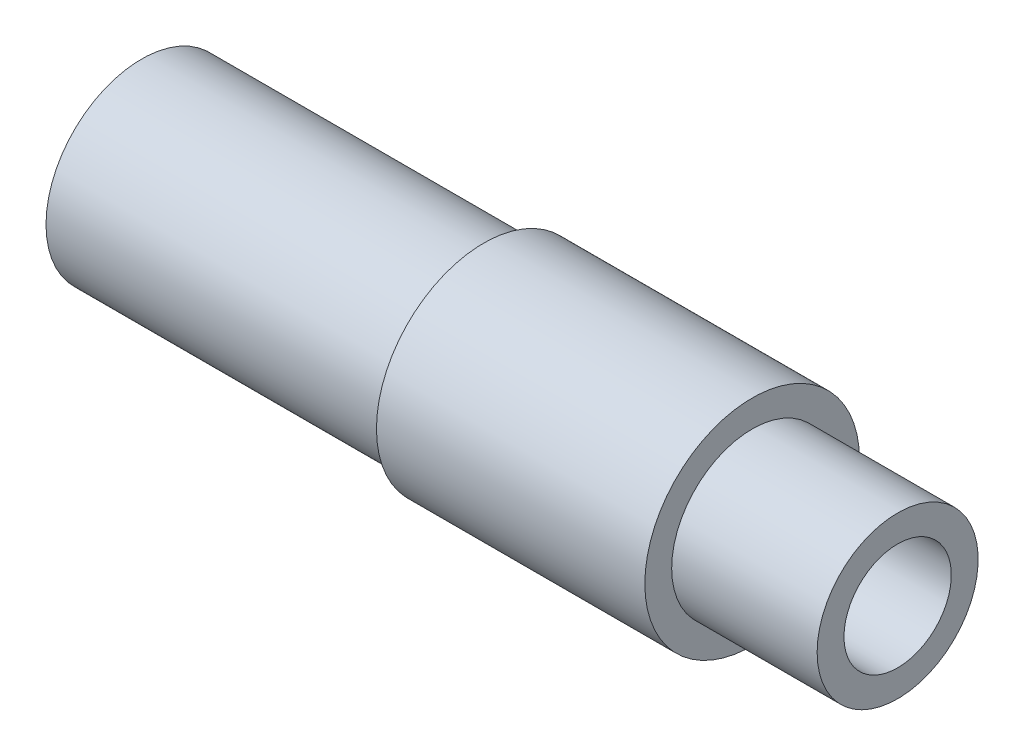
ISO-10303-21;
HEADER;
FILE_DESCRIPTION(('STEP AP214'),'2;1');
FILE_NAME('part.step','',(''),(''),'','','');
FILE_SCHEMA(('AUTOMOTIVE_DESIGN { 1 0 10303 214 1 1 1 1 }'));
ENDSEC;
DATA;
#1=APPLICATION_CONTEXT('core data for automotive mechanical design processes');
#2=APPLICATION_PROTOCOL_DEFINITION('international standard','automotive_design',2000,#1);
#3=PRODUCT_CONTEXT('',#1,'mechanical');
#4=PRODUCT('Part','Part','',(#3));
#5=PRODUCT_RELATED_PRODUCT_CATEGORY('part','',(#4));
#6=PRODUCT_DEFINITION_FORMATION('','',#4);
#7=PRODUCT_DEFINITION_CONTEXT('part definition',#1,'design');
#8=PRODUCT_DEFINITION('design','',#6,#7);
#9=PRODUCT_DEFINITION_SHAPE('','',#8);
#10=(LENGTH_UNIT() NAMED_UNIT(*) SI_UNIT(.MILLI.,.METRE.));
#11=(NAMED_UNIT(*) PLANE_ANGLE_UNIT() SI_UNIT($,.RADIAN.));
#12=(NAMED_UNIT(*) SI_UNIT($,.STERADIAN.) SOLID_ANGLE_UNIT());
#13=UNCERTAINTY_MEASURE_WITH_UNIT(LENGTH_MEASURE(1.E-05),#10,'distance_accuracy_value','');
#14=(GEOMETRIC_REPRESENTATION_CONTEXT(3) GLOBAL_UNCERTAINTY_ASSIGNED_CONTEXT((#13)) GLOBAL_UNIT_ASSIGNED_CONTEXT((#10,
#11,#12)) REPRESENTATION_CONTEXT('',''));
#15=CARTESIAN_POINT('',(0.,0.,0.));
#16=DIRECTION('',(0.,0.,1.));
#17=DIRECTION('',(1.,0.,0.));
#18=AXIS2_PLACEMENT_3D('',#15,#16,#17);
#19=CARTESIAN_POINT('',(-72.1427322201696,0.,0.));
#20=DIRECTION('',(1.,0.,0.));
#21=DIRECTION('',(0.,0.,-1.));
#22=AXIS2_PLACEMENT_3D('',#19,#20,#21);
#23=PLANE('',#22);
#24=CARTESIAN_POINT('',(-72.1427322201696,19.632857647235,0.));
#25=DIRECTION('',(-1.,0.,0.));
#26=DIRECTION('',(0.,0.,1.));
#27=AXIS2_PLACEMENT_3D('',#24,#25,#26);
#28=CIRCLE('',#27,5.125);
#29=CARTESIAN_POINT('',(-72.1427322201696,19.632857647235,5.125));
#30=VERTEX_POINT('',#29);
#31=EDGE_CURVE('E75',#30,#30,#28,.T.);
#32=ORIENTED_EDGE('',*,*,#31,.F.);
#33=EDGE_LOOP('',(#32));
#34=FACE_BOUND('',#33,.T.);
#35=CARTESIAN_POINT('',(-72.1427322201696,19.632857647235,0.));
#36=DIRECTION('',(-1.,0.,0.));
#37=DIRECTION('',(0.,0.,1.));
#38=AXIS2_PLACEMENT_3D('',#35,#36,#37);
#39=CIRCLE('',#38,7.125);
#40=CARTESIAN_POINT('',(-72.1427322201696,19.632857647235,7.125));
#41=VERTEX_POINT('',#40);
#42=EDGE_CURVE('E72',#41,#41,#39,.T.);
#43=ORIENTED_EDGE('',*,*,#42,.T.);
#44=EDGE_LOOP('',(#43));
#45=FACE_BOUND('',#44,.T.);
#46=ADVANCED_FACE('F37',(#34,#45),#23,.F.);
#47=CARTESIAN_POINT('',(-83.6737426979836,19.632857647235,0.));
#48=DIRECTION('',(-1.,0.,0.));
#49=DIRECTION('',(0.,0.,1.));
#50=AXIS2_PLACEMENT_3D('',#47,#48,#49);
#51=CYLINDRICAL_SURFACE('',#50,5.125);
#52=CARTESIAN_POINT('',(-44.6427322201696,19.632857647235,0.));
#53=DIRECTION('',(-1.,0.,0.));
#54=DIRECTION('',(0.,0.,1.));
#55=AXIS2_PLACEMENT_3D('',#52,#53,#54);
#56=CIRCLE('',#55,5.125);
#57=CARTESIAN_POINT('',(-44.6427322201696,19.632857647235,5.125));
#58=VERTEX_POINT('',#57);
#59=EDGE_CURVE('E78',#58,#58,#56,.T.);
#60=ORIENTED_EDGE('',*,*,#59,.F.);
#61=EDGE_LOOP('',(#60));
#62=FACE_BOUND('',#61,.T.);
#63=ORIENTED_EDGE('',*,*,#31,.T.);
#64=EDGE_LOOP('',(#63));
#65=FACE_BOUND('',#64,.T.);
#66=ADVANCED_FACE('F83',(#62,#65),#51,.F.);
#67=CARTESIAN_POINT('',(-44.6427322201696,0.,0.));
#68=DIRECTION('',(-1.,0.,0.));
#69=DIRECTION('',(0.,0.,1.));
#70=AXIS2_PLACEMENT_3D('',#67,#68,#69);
#71=PLANE('',#70);
#72=CARTESIAN_POINT('',(-44.6427322201696,19.632857647235,0.));
#73=DIRECTION('',(-1.,0.,0.));
#74=DIRECTION('',(0.,0.,1.));
#75=AXIS2_PLACEMENT_3D('',#72,#73,#74);
#76=CIRCLE('',#75,6.);
#77=CARTESIAN_POINT('',(-44.6427322201696,19.632857647235,6.));
#78=VERTEX_POINT('',#77);
#79=EDGE_CURVE('E10',#78,#78,#76,.T.);
#80=ORIENTED_EDGE('',*,*,#79,.F.);
#81=EDGE_LOOP('',(#80));
#82=FACE_BOUND('',#81,.T.);
#83=ORIENTED_EDGE('',*,*,#59,.T.);
#84=EDGE_LOOP('',(#83));
#85=FACE_BOUND('',#84,.T.);
#86=ADVANCED_FACE('F39',(#82,#85),#71,.F.);
#87=CARTESIAN_POINT('',(-83.6737426979836,19.632857647235,0.));
#88=DIRECTION('',(-1.,0.,0.));
#89=DIRECTION('',(0.,0.,1.));
#90=AXIS2_PLACEMENT_3D('',#87,#88,#89);
#91=CYLINDRICAL_SURFACE('',#90,7.125);
#92=CARTESIAN_POINT('',(-46.6427322201696,19.632857647235,0.));
#93=DIRECTION('',(-1.,0.,0.));
#94=DIRECTION('',(0.,0.,1.));
#95=AXIS2_PLACEMENT_3D('',#92,#93,#94);
#96=CIRCLE('',#95,7.125);
#97=CARTESIAN_POINT('',(-46.6427322201696,19.632857647235,7.125));
#98=VERTEX_POINT('',#97);
#99=EDGE_CURVE('E69',#98,#98,#96,.T.);
#100=ORIENTED_EDGE('',*,*,#99,.T.);
#101=EDGE_LOOP('',(#100));
#102=FACE_BOUND('',#101,.T.);
#103=ORIENTED_EDGE('',*,*,#42,.F.);
#104=EDGE_LOOP('',(#103));
#105=FACE_BOUND('',#104,.T.);
#106=ADVANCED_FACE('F94',(#102,#105),#91,.T.);
#107=CARTESIAN_POINT('',(-46.6427322201696,0.,0.));
#108=DIRECTION('',(-1.,0.,0.));
#109=DIRECTION('',(0.,0.,1.));
#110=AXIS2_PLACEMENT_3D('',#107,#108,#109);
#111=PLANE('',#110);
#112=CARTESIAN_POINT('',(-46.6427322201696,19.632857647235,0.));
#113=DIRECTION('',(-1.,0.,0.));
#114=DIRECTION('',(0.,0.,1.));
#115=AXIS2_PLACEMENT_3D('',#112,#113,#114);
#116=CIRCLE('',#115,8.);
#117=CARTESIAN_POINT('',(-46.6427322201696,19.632857647235,8.));
#118=VERTEX_POINT('',#117);
#119=EDGE_CURVE('E66',#118,#118,#116,.T.);
#120=ORIENTED_EDGE('',*,*,#119,.T.);
#121=EDGE_LOOP('',(#120));
#122=FACE_BOUND('',#121,.T.);
#123=ORIENTED_EDGE('',*,*,#99,.F.);
#124=EDGE_LOOP('',(#123));
#125=FACE_BOUND('',#124,.T.);
#126=ADVANCED_FACE('F96',(#122,#125),#111,.T.);
#127=CARTESIAN_POINT('',(-83.6737426979836,19.632857647235,0.));
#128=DIRECTION('',(-1.,0.,0.));
#129=DIRECTION('',(0.,0.,1.));
#130=AXIS2_PLACEMENT_3D('',#127,#128,#129);
#131=CYLINDRICAL_SURFACE('',#130,8.);
#132=CARTESIAN_POINT('',(-26.6427322201696,19.632857647235,0.));
#133=DIRECTION('',(-1.,0.,0.));
#134=DIRECTION('',(0.,0.,1.));
#135=AXIS2_PLACEMENT_3D('',#132,#133,#134);
#136=CIRCLE('',#135,8.);
#137=CARTESIAN_POINT('',(-26.6427322201696,19.632857647235,8.));
#138=VERTEX_POINT('',#137);
#139=EDGE_CURVE('E63',#138,#138,#136,.T.);
#140=ORIENTED_EDGE('',*,*,#139,.T.);
#141=EDGE_LOOP('',(#140));
#142=FACE_BOUND('',#141,.T.);
#143=ORIENTED_EDGE('',*,*,#119,.F.);
#144=EDGE_LOOP('',(#143));
#145=FACE_BOUND('',#144,.T.);
#146=ADVANCED_FACE('F103',(#142,#145),#131,.T.);
#147=CARTESIAN_POINT('',(-26.6427322201696,0.,0.));
#148=DIRECTION('',(1.,0.,0.));
#149=DIRECTION('',(0.,0.,-1.));
#150=AXIS2_PLACEMENT_3D('',#147,#148,#149);
#151=PLANE('',#150);
#152=CARTESIAN_POINT('',(-26.6427322201696,19.632857647235,0.));
#153=DIRECTION('',(-1.,0.,0.));
#154=DIRECTION('',(0.,0.,1.));
#155=AXIS2_PLACEMENT_3D('',#152,#153,#154);
#156=CIRCLE('',#155,6.);
#157=CARTESIAN_POINT('',(-26.6427322201696,19.632857647235,6.));
#158=VERTEX_POINT('',#157);
#159=EDGE_CURVE('E60',#158,#158,#156,.T.);
#160=ORIENTED_EDGE('',*,*,#159,.T.);
#161=EDGE_LOOP('',(#160));
#162=FACE_BOUND('',#161,.T.);
#163=ORIENTED_EDGE('',*,*,#139,.F.);
#164=EDGE_LOOP('',(#163));
#165=FACE_BOUND('',#164,.T.);
#166=ADVANCED_FACE('F110',(#162,#165),#151,.T.);
#167=CARTESIAN_POINT('',(-83.6737426979836,19.632857647235,0.));
#168=DIRECTION('',(-1.,0.,0.));
#169=DIRECTION('',(0.,0.,1.));
#170=AXIS2_PLACEMENT_3D('',#167,#168,#169);
#171=CYLINDRICAL_SURFACE('',#170,6.);
#172=CARTESIAN_POINT('',(-15.8034961508885,19.632857647235,0.));
#173=DIRECTION('',(-1.,0.,0.));
#174=DIRECTION('',(0.,0.,1.));
#175=AXIS2_PLACEMENT_3D('',#172,#173,#174);
#176=CIRCLE('',#175,6.);
#177=CARTESIAN_POINT('',(-15.8034961508885,19.632857647235,6.));
#178=VERTEX_POINT('',#177);
#179=EDGE_CURVE('E57',#178,#178,#176,.T.);
#180=ORIENTED_EDGE('',*,*,#179,.T.);
#181=EDGE_LOOP('',(#180));
#182=FACE_BOUND('',#181,.T.);
#183=ORIENTED_EDGE('',*,*,#159,.F.);
#184=EDGE_LOOP('',(#183));
#185=FACE_BOUND('',#184,.T.);
#186=ADVANCED_FACE('F114',(#182,#185),#171,.T.);
#187=CARTESIAN_POINT('',(-15.8034961508885,0.,0.));
#188=DIRECTION('',(1.,0.,0.));
#189=DIRECTION('',(0.,0.,-1.));
#190=AXIS2_PLACEMENT_3D('',#187,#188,#189);
#191=PLANE('',#190);
#192=CARTESIAN_POINT('',(-15.8034961508885,19.632857647235,0.));
#193=DIRECTION('',(-1.,0.,0.));
#194=DIRECTION('',(0.,0.,1.));
#195=AXIS2_PLACEMENT_3D('',#192,#193,#194);
#196=CIRCLE('',#195,4.);
#197=CARTESIAN_POINT('',(-15.8034961508885,19.632857647235,4.));
#198=VERTEX_POINT('',#197);
#199=EDGE_CURVE('E52',#198,#198,#196,.T.);
#200=ORIENTED_EDGE('',*,*,#199,.T.);
#201=EDGE_LOOP('',(#200));
#202=FACE_BOUND('',#201,.T.);
#203=ORIENTED_EDGE('',*,*,#179,.F.);
#204=EDGE_LOOP('',(#203));
#205=FACE_BOUND('',#204,.T.);
#206=ADVANCED_FACE('F118',(#202,#205),#191,.T.);
#207=CARTESIAN_POINT('',(-83.6737426979836,19.632857647235,0.));
#208=DIRECTION('',(-1.,0.,0.));
#209=DIRECTION('',(0.,0.,1.));
#210=AXIS2_PLACEMENT_3D('',#207,#208,#209);
#211=CYLINDRICAL_SURFACE('',#210,4.);
#212=ORIENTED_EDGE('',*,*,#199,.F.);
#213=EDGE_LOOP('',(#212));
#214=FACE_BOUND('',#213,.T.);
#215=CARTESIAN_POINT('',(-28.6427322201696,19.632857647235,0.));
#216=DIRECTION('',(-1.,0.,0.));
#217=DIRECTION('',(0.,0.,1.));
#218=AXIS2_PLACEMENT_3D('',#215,#216,#217);
#219=CIRCLE('',#218,4.);
#220=CARTESIAN_POINT('',(-28.6427322201696,19.632857647235,4.));
#221=VERTEX_POINT('',#220);
#222=EDGE_CURVE('E48',#221,#221,#219,.T.);
#223=ORIENTED_EDGE('',*,*,#222,.T.);
#224=EDGE_LOOP('',(#223));
#225=FACE_BOUND('',#224,.T.);
#226=ADVANCED_FACE('F122',(#214,#225),#211,.F.);
#227=CARTESIAN_POINT('',(-28.6427322201696,0.,0.));
#228=DIRECTION('',(1.,0.,0.));
#229=DIRECTION('',(0.,0.,-1.));
#230=AXIS2_PLACEMENT_3D('',#227,#228,#229);
#231=PLANE('',#230);
#232=ORIENTED_EDGE('',*,*,#222,.F.);
#233=EDGE_LOOP('',(#232));
#234=FACE_BOUND('',#233,.T.);
#235=CARTESIAN_POINT('',(-28.6427322201696,19.632857647235,0.));
#236=DIRECTION('',(-1.,0.,0.));
#237=DIRECTION('',(0.,0.,1.));
#238=AXIS2_PLACEMENT_3D('',#235,#236,#237);
#239=CIRCLE('',#238,6.);
#240=CARTESIAN_POINT('',(-28.6427322201696,19.632857647235,6.));
#241=VERTEX_POINT('',#240);
#242=EDGE_CURVE('E44',#241,#241,#239,.T.);
#243=ORIENTED_EDGE('',*,*,#242,.T.);
#244=EDGE_LOOP('',(#243));
#245=FACE_BOUND('',#244,.T.);
#246=ADVANCED_FACE('F126',(#234,#245),#231,.F.);
#247=CARTESIAN_POINT('',(-83.6737426979836,19.632857647235,0.));
#248=DIRECTION('',(-1.,0.,0.));
#249=DIRECTION('',(0.,0.,1.));
#250=AXIS2_PLACEMENT_3D('',#247,#248,#249);
#251=CYLINDRICAL_SURFACE('',#250,6.);
#252=ORIENTED_EDGE('',*,*,#242,.F.);
#253=EDGE_LOOP('',(#252));
#254=FACE_BOUND('',#253,.T.);
#255=ORIENTED_EDGE('',*,*,#79,.T.);
#256=EDGE_LOOP('',(#255));
#257=FACE_BOUND('',#256,.T.);
#258=ADVANCED_FACE('F129',(#254,#257),#251,.F.);
#259=CLOSED_SHELL('',(#46,#66,#86,#106,#126,#146,#166,#186,#206,#226,#246,#258));
#260=MANIFOLD_SOLID_BREP('B2',#259);
#261=ADVANCED_BREP_SHAPE_REPRESENTATION('',(#18,#260),#14);
#262=SHAPE_DEFINITION_REPRESENTATION(#9,#261);
ENDSEC;
END-ISO-10303-21;
